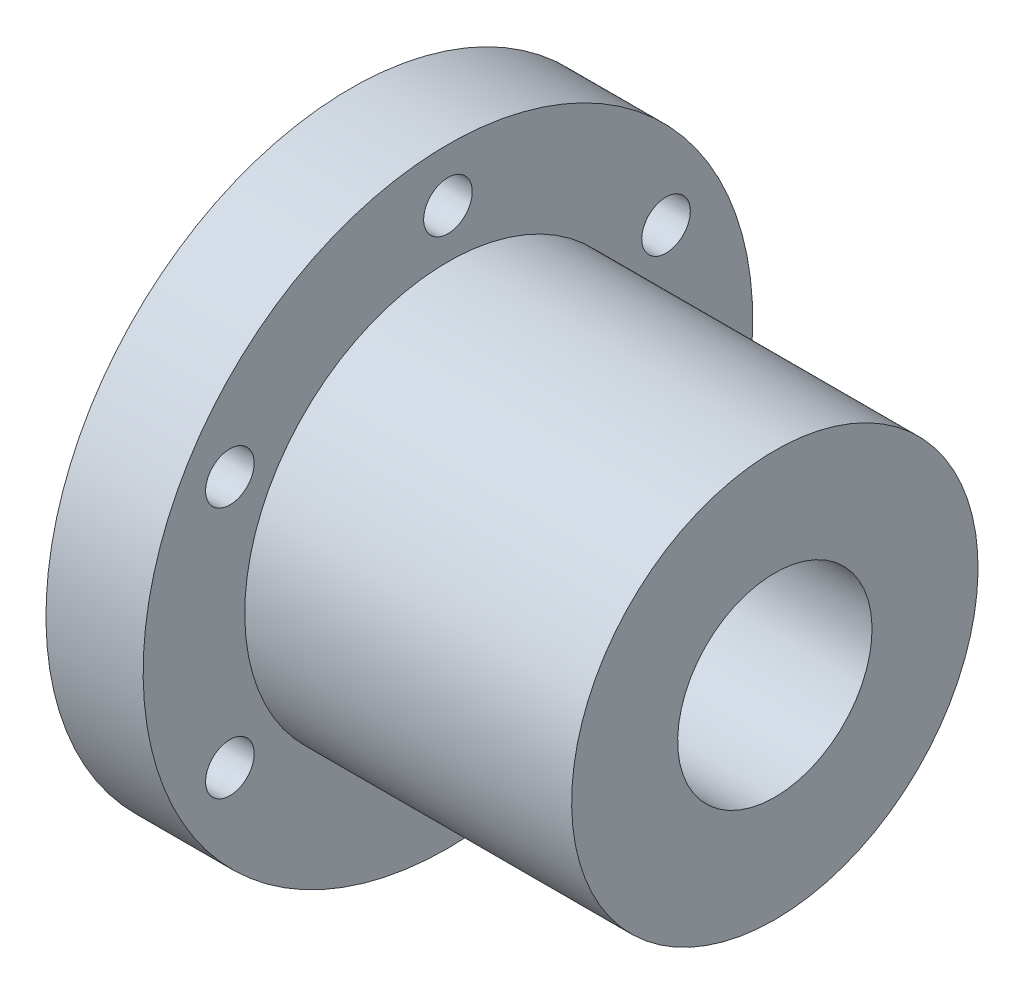
ISO-10303-21;
HEADER;
FILE_DESCRIPTION(('STEP AP214'),'2;1');
FILE_NAME('part.step','',(''),(''),'','','');
FILE_SCHEMA(('AUTOMOTIVE_DESIGN { 1 0 10303 214 1 1 1 1 }'));
ENDSEC;
DATA;
#1=APPLICATION_CONTEXT('core data for automotive mechanical design processes');
#2=APPLICATION_PROTOCOL_DEFINITION('international standard','automotive_design',2000,#1);
#3=PRODUCT_CONTEXT('',#1,'mechanical');
#4=PRODUCT('Part','Part','',(#3));
#5=PRODUCT_RELATED_PRODUCT_CATEGORY('part','',(#4));
#6=PRODUCT_DEFINITION_FORMATION('','',#4);
#7=PRODUCT_DEFINITION_CONTEXT('part definition',#1,'design');
#8=PRODUCT_DEFINITION('design','',#6,#7);
#9=PRODUCT_DEFINITION_SHAPE('','',#8);
#10=(LENGTH_UNIT() NAMED_UNIT(*) SI_UNIT(.MILLI.,.METRE.));
#11=(NAMED_UNIT(*) PLANE_ANGLE_UNIT() SI_UNIT($,.RADIAN.));
#12=(NAMED_UNIT(*) SI_UNIT($,.STERADIAN.) SOLID_ANGLE_UNIT());
#13=UNCERTAINTY_MEASURE_WITH_UNIT(LENGTH_MEASURE(1.E-05),#10,'distance_accuracy_value','');
#14=(GEOMETRIC_REPRESENTATION_CONTEXT(3) GLOBAL_UNCERTAINTY_ASSIGNED_CONTEXT((#13)) GLOBAL_UNIT_ASSIGNED_CONTEXT((#10,
#11,#12)) REPRESENTATION_CONTEXT('',''));
#15=CARTESIAN_POINT('',(0.,0.,0.));
#16=DIRECTION('',(0.,0.,1.));
#17=DIRECTION('',(1.,0.,0.));
#18=AXIS2_PLACEMENT_3D('',#15,#16,#17);
#19=CARTESIAN_POINT('',(24.001,-14.2499999999999,24.6817240078565));
#20=DIRECTION('',(-1.,0.,0.));
#21=DIRECTION('',(0.,-1.,0.));
#22=AXIS2_PLACEMENT_3D('',#19,#20,#21);
#23=CYLINDRICAL_SURFACE('',#22,2.75);
#24=CARTESIAN_POINT('',(-13.,-14.2499999999999,24.6817240078565));
#25=DIRECTION('',(-1.,0.,0.));
#26=DIRECTION('',(0.,-1.,0.));
#27=AXIS2_PLACEMENT_3D('',#24,#25,#26);
#28=CIRCLE('',#27,2.75);
#29=CARTESIAN_POINT('',(-13.,-16.9999999999999,24.6817240078565));
#30=VERTEX_POINT('',#29);
#31=EDGE_CURVE('E80',#30,#30,#28,.F.);
#32=ORIENTED_EDGE('',*,*,#31,.T.);
#33=EDGE_LOOP('',(#32));
#34=FACE_BOUND('',#33,.T.);
#35=CARTESIAN_POINT('',(-18.5,-14.2499999999999,24.6817240078565));
#36=DIRECTION('',(-1.,0.,0.));
#37=DIRECTION('',(0.,-1.,0.));
#38=AXIS2_PLACEMENT_3D('',#35,#36,#37);
#39=CIRCLE('',#38,2.75);
#40=CARTESIAN_POINT('',(-18.5,-16.9999999999999,24.6817240078565));
#41=VERTEX_POINT('',#40);
#42=EDGE_CURVE('E35',#41,#41,#39,.F.);
#43=ORIENTED_EDGE('',*,*,#42,.F.);
#44=EDGE_LOOP('',(#43));
#45=FACE_BOUND('',#44,.T.);
#46=ADVANCED_FACE('F31',(#34,#45),#23,.F.);
#47=CARTESIAN_POINT('',(24.001,14.2500000000001,24.6817240078564));
#48=DIRECTION('',(-1.,0.,0.));
#49=DIRECTION('',(0.,-1.,0.));
#50=AXIS2_PLACEMENT_3D('',#47,#48,#49);
#51=CYLINDRICAL_SURFACE('',#50,2.75);
#52=CARTESIAN_POINT('',(-13.,14.2500000000001,24.6817240078564));
#53=DIRECTION('',(-1.,0.,0.));
#54=DIRECTION('',(0.,-1.,0.));
#55=AXIS2_PLACEMENT_3D('',#52,#53,#54);
#56=CIRCLE('',#55,2.75);
#57=CARTESIAN_POINT('',(-13.,11.5000000000001,24.6817240078564));
#58=VERTEX_POINT('',#57);
#59=EDGE_CURVE('E84',#58,#58,#56,.F.);
#60=ORIENTED_EDGE('',*,*,#59,.T.);
#61=EDGE_LOOP('',(#60));
#62=FACE_BOUND('',#61,.T.);
#63=CARTESIAN_POINT('',(-18.5,14.2500000000001,24.6817240078564));
#64=DIRECTION('',(-1.,0.,0.));
#65=DIRECTION('',(0.,-1.,0.));
#66=AXIS2_PLACEMENT_3D('',#63,#64,#65);
#67=CIRCLE('',#66,2.75);
#68=CARTESIAN_POINT('',(-18.5,11.5000000000001,24.6817240078564));
#69=VERTEX_POINT('',#68);
#70=EDGE_CURVE('E62',#69,#69,#67,.F.);
#71=ORIENTED_EDGE('',*,*,#70,.F.);
#72=EDGE_LOOP('',(#71));
#73=FACE_BOUND('',#72,.T.);
#74=ADVANCED_FACE('F138',(#62,#73),#51,.F.);
#75=CARTESIAN_POINT('',(24.001,28.5,0.));
#76=DIRECTION('',(-1.,0.,0.));
#77=DIRECTION('',(0.,-1.,0.));
#78=AXIS2_PLACEMENT_3D('',#75,#76,#77);
#79=CYLINDRICAL_SURFACE('',#78,2.75);
#80=CARTESIAN_POINT('',(-13.,28.5,0.));
#81=DIRECTION('',(-1.,0.,0.));
#82=DIRECTION('',(0.,-1.,0.));
#83=AXIS2_PLACEMENT_3D('',#80,#81,#82);
#84=CIRCLE('',#83,2.75);
#85=CARTESIAN_POINT('',(-13.,25.75,0.));
#86=VERTEX_POINT('',#85);
#87=EDGE_CURVE('E76',#86,#86,#84,.F.);
#88=CARTESIAN_POINT('',(-18.5,28.5,0.));
#89=DIRECTION('',(-1.,0.,0.));
#90=DIRECTION('',(0.,-1.,0.));
#91=AXIS2_PLACEMENT_3D('',#88,#89,#90);
#92=CIRCLE('',#91,2.75);
#93=CARTESIAN_POINT('',(-18.5,25.75,0.));
#94=VERTEX_POINT('',#93);
#95=EDGE_CURVE('E60',#94,#94,#92,.F.);
#96=CARTESIAN_POINT('',(-13.,25.75,0.));
#97=CARTESIAN_POINT('',(-13.0572916666667,25.75,0.));
#98=CARTESIAN_POINT('',(-13.1145833333333,25.75,0.));
#99=CARTESIAN_POINT('',(-13.2291666666667,25.75,0.));
#100=CARTESIAN_POINT('',(-13.2864583333333,25.75,0.));
#101=CARTESIAN_POINT('',(-13.4010416666667,25.75,0.));
#102=CARTESIAN_POINT('',(-13.4583333333333,25.75,0.));
#103=CARTESIAN_POINT('',(-13.5729166666667,25.75,0.));
#104=CARTESIAN_POINT('',(-13.6302083333333,25.75,0.));
#105=CARTESIAN_POINT('',(-13.7447916666667,25.75,0.));
#106=CARTESIAN_POINT('',(-13.8020833333333,25.75,0.));
#107=CARTESIAN_POINT('',(-13.9166666666667,25.75,0.));
#108=CARTESIAN_POINT('',(-13.9739583333333,25.75,0.));
#109=CARTESIAN_POINT('',(-14.0885416666667,25.75,0.));
#110=CARTESIAN_POINT('',(-14.1458333333333,25.75,0.));
#111=CARTESIAN_POINT('',(-14.2604166666667,25.75,0.));
#112=CARTESIAN_POINT('',(-14.3177083333333,25.75,0.));
#113=CARTESIAN_POINT('',(-14.4322916666667,25.75,0.));
#114=CARTESIAN_POINT('',(-14.4895833333333,25.75,0.));
#115=CARTESIAN_POINT('',(-14.6041666666667,25.75,0.));
#116=CARTESIAN_POINT('',(-14.6614583333333,25.75,0.));
#117=CARTESIAN_POINT('',(-14.7760416666667,25.75,0.));
#118=CARTESIAN_POINT('',(-14.8333333333333,25.75,0.));
#119=CARTESIAN_POINT('',(-14.9479166666667,25.75,0.));
#120=CARTESIAN_POINT('',(-15.0052083333333,25.75,0.));
#121=CARTESIAN_POINT('',(-15.1197916666667,25.75,0.));
#122=CARTESIAN_POINT('',(-15.1770833333333,25.75,0.));
#123=CARTESIAN_POINT('',(-15.2916666666667,25.75,0.));
#124=CARTESIAN_POINT('',(-15.3489583333333,25.75,0.));
#125=CARTESIAN_POINT('',(-15.4635416666667,25.75,0.));
#126=CARTESIAN_POINT('',(-15.5208333333333,25.75,0.));
#127=CARTESIAN_POINT('',(-15.6354166666667,25.75,0.));
#128=CARTESIAN_POINT('',(-15.6927083333333,25.75,0.));
#129=CARTESIAN_POINT('',(-15.8072916666667,25.75,0.));
#130=CARTESIAN_POINT('',(-15.8645833333333,25.75,0.));
#131=CARTESIAN_POINT('',(-15.9791666666667,25.75,0.));
#132=CARTESIAN_POINT('',(-16.0364583333333,25.75,0.));
#133=CARTESIAN_POINT('',(-16.1510416666667,25.75,0.));
#134=CARTESIAN_POINT('',(-16.2083333333333,25.75,0.));
#135=CARTESIAN_POINT('',(-16.3229166666667,25.75,0.));
#136=CARTESIAN_POINT('',(-16.3802083333333,25.75,0.));
#137=CARTESIAN_POINT('',(-16.4947916666667,25.75,0.));
#138=CARTESIAN_POINT('',(-16.5520833333333,25.75,0.));
#139=CARTESIAN_POINT('',(-16.6666666666667,25.75,0.));
#140=CARTESIAN_POINT('',(-16.7239583333333,25.75,0.));
#141=CARTESIAN_POINT('',(-16.8385416666667,25.75,0.));
#142=CARTESIAN_POINT('',(-16.8958333333333,25.75,0.));
#143=CARTESIAN_POINT('',(-17.0104166666667,25.75,0.));
#144=CARTESIAN_POINT('',(-17.0677083333333,25.75,0.));
#145=CARTESIAN_POINT('',(-17.1822916666667,25.75,0.));
#146=CARTESIAN_POINT('',(-17.2395833333333,25.75,0.));
#147=CARTESIAN_POINT('',(-17.3541666666667,25.75,0.));
#148=CARTESIAN_POINT('',(-17.4114583333333,25.75,0.));
#149=CARTESIAN_POINT('',(-17.5260416666667,25.75,0.));
#150=CARTESIAN_POINT('',(-17.5833333333333,25.75,0.));
#151=CARTESIAN_POINT('',(-17.6979166666667,25.75,0.));
#152=CARTESIAN_POINT('',(-17.7552083333333,25.75,0.));
#153=CARTESIAN_POINT('',(-17.8697916666667,25.75,0.));
#154=CARTESIAN_POINT('',(-17.9270833333333,25.75,0.));
#155=CARTESIAN_POINT('',(-18.0416666666667,25.75,0.));
#156=CARTESIAN_POINT('',(-18.0989583333333,25.75,0.));
#157=CARTESIAN_POINT('',(-18.2135416666667,25.75,0.));
#158=CARTESIAN_POINT('',(-18.2708333333333,25.75,0.));
#159=CARTESIAN_POINT('',(-18.3854166666667,25.75,0.));
#160=CARTESIAN_POINT('',(-18.4427083333333,25.75,0.));
#161=CARTESIAN_POINT('',(-18.5,25.75,0.));
#162=B_SPLINE_CURVE_WITH_KNOTS('',3,(#96,#97,#98,#99,#100,#101,#102,#103,#104,#105,#106,#107,
#108,#109,#110,#111,#112,#113,#114,#115,#116,#117,#118,#119,#120,#121,#122,#123,#124,#125,#126,
#127,#128,#129,#130,#131,#132,#133,#134,#135,#136,#137,#138,#139,#140,#141,#142,#143,#144,#145,
#146,#147,#148,#149,#150,#151,#152,#153,#154,#155,#156,#157,#158,#159,#160,#161),.UNSPECIFIED.,
.F.,.F.,(4,2,2,2,2,2,2,2,2,2,2,2,2,2,2,2,2,2,2,2,2,2,2,2,2,2,2,2,2,2,2,2,4),(0.,
0.171875000000002,0.343750000000004,0.515624999999999,0.687500000000001,0.859375000000002,
1.03125,1.203125,1.375,1.546875,1.71875,1.890625,2.0625,2.234375,2.40625,2.578125,2.75,2.921875,
3.09375000000001,3.265625,3.4375,3.609375,3.78125,3.953125,4.125,4.29687500000001,
4.46875000000001,4.640625,4.8125,4.98437500000001,5.15625,5.328125,5.50000000000001),.UNSPECIFIED.);
#163=EDGE_CURVE('BSEAM144',#86,#94,#162,.T.);
#164=ORIENTED_EDGE('',*,*,#87,.T.);
#165=ORIENTED_EDGE('',*,*,#95,.F.);
#166=ORIENTED_EDGE('',*,*,#163,.T.);
#167=ORIENTED_EDGE('',*,*,#163,.F.);
#168=EDGE_LOOP('',(#164,#166,#165,#167));
#169=FACE_BOUND('',#168,.T.);
#170=ADVANCED_FACE('F144',(#169),#79,.F.);
#171=CARTESIAN_POINT('',(24.001,14.2499999999998,-24.6817240078566));
#172=DIRECTION('',(-1.,0.,0.));
#173=DIRECTION('',(0.,-1.,0.));
#174=AXIS2_PLACEMENT_3D('',#171,#172,#173);
#175=CYLINDRICAL_SURFACE('',#174,2.75);
#176=CARTESIAN_POINT('',(-13.,14.2499999999998,-24.6817240078566));
#177=DIRECTION('',(-1.,0.,0.));
#178=DIRECTION('',(0.,-1.,0.));
#179=AXIS2_PLACEMENT_3D('',#176,#177,#178);
#180=CIRCLE('',#179,2.75);
#181=CARTESIAN_POINT('',(-13.,11.4999999999998,-24.6817240078566));
#182=VERTEX_POINT('',#181);
#183=EDGE_CURVE('E71',#182,#182,#180,.F.);
#184=ORIENTED_EDGE('',*,*,#183,.T.);
#185=EDGE_LOOP('',(#184));
#186=FACE_BOUND('',#185,.T.);
#187=CARTESIAN_POINT('',(-18.5,14.2499999999998,-24.6817240078566));
#188=DIRECTION('',(-1.,0.,0.));
#189=DIRECTION('',(0.,-1.,0.));
#190=AXIS2_PLACEMENT_3D('',#187,#188,#189);
#191=CIRCLE('',#190,2.75);
#192=CARTESIAN_POINT('',(-18.5,11.4999999999998,-24.6817240078566));
#193=VERTEX_POINT('',#192);
#194=EDGE_CURVE('E56',#193,#193,#191,.F.);
#195=ORIENTED_EDGE('',*,*,#194,.F.);
#196=EDGE_LOOP('',(#195));
#197=FACE_BOUND('',#196,.T.);
#198=ADVANCED_FACE('F241',(#186,#197),#175,.F.);
#199=CARTESIAN_POINT('',(24.001,-14.2500000000003,-24.6817240078563));
#200=DIRECTION('',(-1.,0.,0.));
#201=DIRECTION('',(0.,-1.,0.));
#202=AXIS2_PLACEMENT_3D('',#199,#200,#201);
#203=CYLINDRICAL_SURFACE('',#202,2.75);
#204=CARTESIAN_POINT('',(-13.,-14.2500000000003,-24.6817240078563));
#205=DIRECTION('',(-1.,0.,0.));
#206=DIRECTION('',(0.,-1.,0.));
#207=AXIS2_PLACEMENT_3D('',#204,#205,#206);
#208=CIRCLE('',#207,2.75);
#209=CARTESIAN_POINT('',(-13.,-17.0000000000003,-24.6817240078563));
#210=VERTEX_POINT('',#209);
#211=EDGE_CURVE('E67',#210,#210,#208,.F.);
#212=ORIENTED_EDGE('',*,*,#211,.T.);
#213=EDGE_LOOP('',(#212));
#214=FACE_BOUND('',#213,.T.);
#215=CARTESIAN_POINT('',(-18.5,-14.2500000000003,-24.6817240078563));
#216=DIRECTION('',(-1.,0.,0.));
#217=DIRECTION('',(0.,-1.,0.));
#218=AXIS2_PLACEMENT_3D('',#215,#216,#217);
#219=CIRCLE('',#218,2.75);
#220=CARTESIAN_POINT('',(-18.5,-17.0000000000003,-24.6817240078563));
#221=VERTEX_POINT('',#220);
#222=EDGE_CURVE('E53',#221,#221,#219,.F.);
#223=ORIENTED_EDGE('',*,*,#222,.F.);
#224=EDGE_LOOP('',(#223));
#225=FACE_BOUND('',#224,.T.);
#226=ADVANCED_FACE('F132',(#214,#225),#203,.F.);
#227=CARTESIAN_POINT('',(24.001,-28.5,0.));
#228=DIRECTION('',(-1.,0.,0.));
#229=DIRECTION('',(0.,-1.,0.));
#230=AXIS2_PLACEMENT_3D('',#227,#228,#229);
#231=CYLINDRICAL_SURFACE('',#230,2.75);
#232=CARTESIAN_POINT('',(-13.,-28.5,0.));
#233=DIRECTION('',(-1.,0.,0.));
#234=DIRECTION('',(0.,-1.,0.));
#235=AXIS2_PLACEMENT_3D('',#232,#233,#234);
#236=CIRCLE('',#235,2.75);
#237=CARTESIAN_POINT('',(-13.,-31.25,0.));
#238=VERTEX_POINT('',#237);
#239=EDGE_CURVE('E51',#238,#238,#236,.F.);
#240=CARTESIAN_POINT('',(-18.5,-28.5,0.));
#241=DIRECTION('',(-1.,0.,0.));
#242=DIRECTION('',(0.,-1.,0.));
#243=AXIS2_PLACEMENT_3D('',#240,#241,#242);
#244=CIRCLE('',#243,2.75);
#245=CARTESIAN_POINT('',(-18.5,-31.25,0.));
#246=VERTEX_POINT('',#245);
#247=EDGE_CURVE('E48',#246,#246,#244,.F.);
#248=CARTESIAN_POINT('',(-13.,-31.25,0.));
#249=CARTESIAN_POINT('',(-13.0572916666667,-31.25,0.));
#250=CARTESIAN_POINT('',(-13.1145833333333,-31.25,0.));
#251=CARTESIAN_POINT('',(-13.2291666666667,-31.25,0.));
#252=CARTESIAN_POINT('',(-13.2864583333333,-31.25,0.));
#253=CARTESIAN_POINT('',(-13.4010416666667,-31.25,0.));
#254=CARTESIAN_POINT('',(-13.4583333333333,-31.25,0.));
#255=CARTESIAN_POINT('',(-13.5729166666667,-31.25,0.));
#256=CARTESIAN_POINT('',(-13.6302083333333,-31.25,0.));
#257=CARTESIAN_POINT('',(-13.7447916666667,-31.25,0.));
#258=CARTESIAN_POINT('',(-13.8020833333333,-31.25,0.));
#259=CARTESIAN_POINT('',(-13.9166666666667,-31.25,0.));
#260=CARTESIAN_POINT('',(-13.9739583333333,-31.25,0.));
#261=CARTESIAN_POINT('',(-14.0885416666667,-31.25,0.));
#262=CARTESIAN_POINT('',(-14.1458333333333,-31.25,0.));
#263=CARTESIAN_POINT('',(-14.2604166666667,-31.25,0.));
#264=CARTESIAN_POINT('',(-14.3177083333333,-31.25,0.));
#265=CARTESIAN_POINT('',(-14.4322916666667,-31.25,0.));
#266=CARTESIAN_POINT('',(-14.4895833333333,-31.25,0.));
#267=CARTESIAN_POINT('',(-14.6041666666667,-31.25,0.));
#268=CARTESIAN_POINT('',(-14.6614583333333,-31.25,0.));
#269=CARTESIAN_POINT('',(-14.7760416666667,-31.25,0.));
#270=CARTESIAN_POINT('',(-14.8333333333333,-31.25,0.));
#271=CARTESIAN_POINT('',(-14.9479166666667,-31.25,0.));
#272=CARTESIAN_POINT('',(-15.0052083333333,-31.25,0.));
#273=CARTESIAN_POINT('',(-15.1197916666667,-31.25,0.));
#274=CARTESIAN_POINT('',(-15.1770833333333,-31.25,0.));
#275=CARTESIAN_POINT('',(-15.2916666666667,-31.25,0.));
#276=CARTESIAN_POINT('',(-15.3489583333333,-31.25,0.));
#277=CARTESIAN_POINT('',(-15.4635416666667,-31.25,0.));
#278=CARTESIAN_POINT('',(-15.5208333333333,-31.25,0.));
#279=CARTESIAN_POINT('',(-15.6354166666666,-31.25,0.));
#280=CARTESIAN_POINT('',(-15.6927083333333,-31.25,0.));
#281=CARTESIAN_POINT('',(-15.8072916666667,-31.25,0.));
#282=CARTESIAN_POINT('',(-15.8645833333333,-31.25,0.));
#283=CARTESIAN_POINT('',(-15.9791666666666,-31.25,0.));
#284=CARTESIAN_POINT('',(-16.0364583333333,-31.25,0.));
#285=CARTESIAN_POINT('',(-16.1510416666666,-31.25,0.));
#286=CARTESIAN_POINT('',(-16.2083333333333,-31.25,0.));
#287=CARTESIAN_POINT('',(-16.3229166666667,-31.25,0.));
#288=CARTESIAN_POINT('',(-16.3802083333333,-31.25,0.));
#289=CARTESIAN_POINT('',(-16.4947916666666,-31.25,0.));
#290=CARTESIAN_POINT('',(-16.5520833333333,-31.25,0.));
#291=CARTESIAN_POINT('',(-16.6666666666666,-31.25,0.));
#292=CARTESIAN_POINT('',(-16.7239583333333,-31.25,0.));
#293=CARTESIAN_POINT('',(-16.8385416666666,-31.25,0.));
#294=CARTESIAN_POINT('',(-16.8958333333333,-31.25,0.));
#295=CARTESIAN_POINT('',(-17.0104166666666,-31.25,0.));
#296=CARTESIAN_POINT('',(-17.0677083333333,-31.25,0.));
#297=CARTESIAN_POINT('',(-17.1822916666666,-31.25,0.));
#298=CARTESIAN_POINT('',(-17.2395833333333,-31.25,0.));
#299=CARTESIAN_POINT('',(-17.3541666666666,-31.25,0.));
#300=CARTESIAN_POINT('',(-17.4114583333333,-31.25,0.));
#301=CARTESIAN_POINT('',(-17.5260416666666,-31.25,0.));
#302=CARTESIAN_POINT('',(-17.5833333333333,-31.25,0.));
#303=CARTESIAN_POINT('',(-17.6979166666666,-31.25,0.));
#304=CARTESIAN_POINT('',(-17.7552083333333,-31.25,0.));
#305=CARTESIAN_POINT('',(-17.8697916666666,-31.25,0.));
#306=CARTESIAN_POINT('',(-17.9270833333333,-31.25,0.));
#307=CARTESIAN_POINT('',(-18.0416666666666,-31.25,0.));
#308=CARTESIAN_POINT('',(-18.0989583333333,-31.25,0.));
#309=CARTESIAN_POINT('',(-18.2135416666666,-31.25,0.));
#310=CARTESIAN_POINT('',(-18.2708333333333,-31.25,0.));
#311=CARTESIAN_POINT('',(-18.3854166666666,-31.25,0.));
#312=CARTESIAN_POINT('',(-18.4427083333333,-31.25,0.));
#313=CARTESIAN_POINT('',(-18.5,-31.25,0.));
#314=B_SPLINE_CURVE_WITH_KNOTS('',3,(#248,#249,#250,#251,#252,#253,#254,#255,#256,#257,#258,
#259,#260,#261,#262,#263,#264,#265,#266,#267,#268,#269,#270,#271,#272,#273,#274,#275,#276,#277,
#278,#279,#280,#281,#282,#283,#284,#285,#286,#287,#288,#289,#290,#291,#292,#293,#294,#295,#296,
#297,#298,#299,#300,#301,#302,#303,#304,#305,#306,#307,#308,#309,#310,#311,#312,#313),
.UNSPECIFIED.,.F.,.F.,(4,2,2,2,2,2,2,2,2,2,2,2,2,2,2,2,2,2,2,2,2,2,2,2,2,2,2,2,2,2,2,2,4),(0.,
0.171875000000002,0.343749999999997,0.515624999999999,0.687500000000001,0.859374999999996,
1.03125,1.203125,1.375,1.546875,1.71875,1.890625,2.06249999999999,2.234375,2.40625,
2.57812499999999,2.75,2.921875,3.09374999999999,3.26562499999999,3.4375,3.60937499999999,
3.78124999999999,3.95312499999999,4.12499999999999,4.29687499999999,4.46874999999999,4.640625,
4.81249999999999,4.98437499999999,5.15624999999999,5.32812499999999,5.49999999999999),.UNSPECIFIED.);
#315=EDGE_CURVE('BSEAM125',#238,#246,#314,.T.);
#316=ORIENTED_EDGE('',*,*,#239,.T.);
#317=ORIENTED_EDGE('',*,*,#247,.F.);
#318=ORIENTED_EDGE('',*,*,#315,.T.);
#319=ORIENTED_EDGE('',*,*,#315,.F.);
#320=EDGE_LOOP('',(#316,#318,#317,#319));
#321=FACE_BOUND('',#320,.T.);
#322=ADVANCED_FACE('F125',(#321),#231,.F.);
#323=CARTESIAN_POINT('',(-24.,11.,0.));
#324=DIRECTION('',(1.,0.,0.));
#325=DIRECTION('',(0.,1.,0.));
#326=AXIS2_PLACEMENT_3D('',#323,#324,#325);
#327=PLANE('',#326);
#328=CARTESIAN_POINT('',(-24.,-14.2500000000003,-24.6817240078563));
#329=DIRECTION('',(-1.,0.,0.));
#330=DIRECTION('',(0.,-0.50000000000001,-0.866025403784433));
#331=AXIS2_PLACEMENT_3D('',#328,#329,#330);
#332=CIRCLE('',#331,4.75);
#333=CARTESIAN_POINT('',(-24.,-16.6250000000003,-28.7953446758324));
#334=VERTEX_POINT('',#333);
#335=EDGE_CURVE('E189',#334,#334,#332,.T.);
#336=ORIENTED_EDGE('',*,*,#335,.F.);
#337=EDGE_LOOP('',(#336));
#338=FACE_BOUND('',#337,.T.);
#339=CARTESIAN_POINT('',(-24.,14.2499999999998,-24.6817240078566));
#340=DIRECTION('',(-1.,0.,0.));
#341=DIRECTION('',(0.,0.499999999999992,-0.866025403784443));
#342=AXIS2_PLACEMENT_3D('',#339,#340,#341);
#343=CIRCLE('',#342,4.75);
#344=CARTESIAN_POINT('',(-24.,16.6249999999997,-28.7953446758327));
#345=VERTEX_POINT('',#344);
#346=EDGE_CURVE('E195',#345,#345,#343,.T.);
#347=ORIENTED_EDGE('',*,*,#346,.F.);
#348=EDGE_LOOP('',(#347));
#349=FACE_BOUND('',#348,.T.);
#350=CARTESIAN_POINT('',(-24.,28.5,0.));
#351=DIRECTION('',(-1.,0.,0.));
#352=DIRECTION('',(0.,1.,0.));
#353=AXIS2_PLACEMENT_3D('',#350,#351,#352);
#354=CIRCLE('',#353,4.75);
#355=CARTESIAN_POINT('',(-24.,33.25,0.));
#356=VERTEX_POINT('',#355);
#357=EDGE_CURVE('E201',#356,#356,#354,.T.);
#358=ORIENTED_EDGE('',*,*,#357,.F.);
#359=EDGE_LOOP('',(#358));
#360=FACE_BOUND('',#359,.T.);
#361=CARTESIAN_POINT('',(-24.,14.2500000000001,24.6817240078564));
#362=DIRECTION('',(-1.,0.,0.));
#363=DIRECTION('',(0.,0.500000000000004,0.866025403784436));
#364=AXIS2_PLACEMENT_3D('',#361,#362,#363);
#365=CIRCLE('',#364,4.75);
#366=CARTESIAN_POINT('',(-24.,16.6250000000001,28.7953446758325));
#367=VERTEX_POINT('',#366);
#368=EDGE_CURVE('E207',#367,#367,#365,.T.);
#369=ORIENTED_EDGE('',*,*,#368,.F.);
#370=EDGE_LOOP('',(#369));
#371=FACE_BOUND('',#370,.T.);
#372=CARTESIAN_POINT('',(-24.,-14.2499999999999,24.6817240078565));
#373=DIRECTION('',(-1.,0.,0.));
#374=DIRECTION('',(0.,-0.499999999999998,0.86602540378444));
#375=AXIS2_PLACEMENT_3D('',#372,#373,#374);
#376=CIRCLE('',#375,4.75);
#377=CARTESIAN_POINT('',(-24.,-16.6249999999999,28.7953446758326));
#378=VERTEX_POINT('',#377);
#379=EDGE_CURVE('E183',#378,#378,#376,.T.);
#380=ORIENTED_EDGE('',*,*,#379,.F.);
#381=EDGE_LOOP('',(#380));
#382=FACE_BOUND('',#381,.T.);
#383=CARTESIAN_POINT('',(-24.,-28.5,0.));
#384=DIRECTION('',(-1.,0.,0.));
#385=DIRECTION('',(0.,-1.,0.));
#386=AXIS2_PLACEMENT_3D('',#383,#384,#385);
#387=CIRCLE('',#386,4.75);
#388=CARTESIAN_POINT('',(-24.,-33.25,0.));
#389=VERTEX_POINT('',#388);
#390=EDGE_CURVE('E83',#389,#389,#387,.T.);
#391=ORIENTED_EDGE('',*,*,#390,.F.);
#392=EDGE_LOOP('',(#391));
#393=FACE_BOUND('',#392,.T.);
#394=CARTESIAN_POINT('',(-24.,0.,0.));
#395=DIRECTION('',(-1.,0.,0.));
#396=DIRECTION('',(0.,-1.,0.));
#397=AXIS2_PLACEMENT_3D('',#394,#395,#396);
#398=CIRCLE('',#397,11.);
#399=CARTESIAN_POINT('',(-24.,-11.,0.));
#400=VERTEX_POINT('',#399);
#401=EDGE_CURVE('E91',#400,#400,#398,.T.);
#402=ORIENTED_EDGE('',*,*,#401,.F.);
#403=EDGE_LOOP('',(#402));
#404=FACE_BOUND('',#403,.T.);
#405=CARTESIAN_POINT('',(-24.,0.,0.));
#406=DIRECTION('',(-1.,0.,0.));
#407=DIRECTION('',(0.,-1.,0.));
#408=AXIS2_PLACEMENT_3D('',#405,#406,#407);
#409=CIRCLE('',#408,34.5);
#410=CARTESIAN_POINT('',(-24.,-34.5,0.));
#411=VERTEX_POINT('',#410);
#412=EDGE_CURVE('E10',#411,#411,#409,.T.);
#413=ORIENTED_EDGE('',*,*,#412,.T.);
#414=EDGE_LOOP('',(#413));
#415=FACE_BOUND('',#414,.T.);
#416=ADVANCED_FACE('F33',(#338,#349,#360,#371,#382,#393,#404,#415),#327,.F.);
#417=CARTESIAN_POINT('',(-82.1060159268319,0.,0.));
#418=DIRECTION('',(-1.,0.,0.));
#419=DIRECTION('',(0.,-1.,0.));
#420=AXIS2_PLACEMENT_3D('',#417,#418,#419);
#421=CYLINDRICAL_SURFACE('',#420,34.5);
#422=ORIENTED_EDGE('',*,*,#412,.F.);
#423=EDGE_LOOP('',(#422));
#424=FACE_BOUND('',#423,.T.);
#425=CARTESIAN_POINT('',(-13.,0.,0.));
#426=DIRECTION('',(-1.,0.,0.));
#427=DIRECTION('',(0.,-1.,0.));
#428=AXIS2_PLACEMENT_3D('',#425,#426,#427);
#429=CIRCLE('',#428,34.5);
#430=CARTESIAN_POINT('',(-13.,-34.5,0.));
#431=VERTEX_POINT('',#430);
#432=EDGE_CURVE('E39',#431,#431,#429,.T.);
#433=ORIENTED_EDGE('',*,*,#432,.T.);
#434=EDGE_LOOP('',(#433));
#435=FACE_BOUND('',#434,.T.);
#436=ADVANCED_FACE('F124',(#424,#435),#421,.T.);
#437=CARTESIAN_POINT('',(-13.,34.5,0.));
#438=DIRECTION('',(-1.,0.,0.));
#439=DIRECTION('',(0.,-1.,0.));
#440=AXIS2_PLACEMENT_3D('',#437,#438,#439);
#441=PLANE('',#440);
#442=ORIENTED_EDGE('',*,*,#211,.F.);
#443=EDGE_LOOP('',(#442));
#444=FACE_BOUND('',#443,.T.);
#445=ORIENTED_EDGE('',*,*,#183,.F.);
#446=EDGE_LOOP('',(#445));
#447=FACE_BOUND('',#446,.T.);
#448=ORIENTED_EDGE('',*,*,#87,.F.);
#449=EDGE_LOOP('',(#448));
#450=FACE_BOUND('',#449,.T.);
#451=ORIENTED_EDGE('',*,*,#59,.F.);
#452=EDGE_LOOP('',(#451));
#453=FACE_BOUND('',#452,.T.);
#454=ORIENTED_EDGE('',*,*,#31,.F.);
#455=EDGE_LOOP('',(#454));
#456=FACE_BOUND('',#455,.T.);
#457=ORIENTED_EDGE('',*,*,#239,.F.);
#458=EDGE_LOOP('',(#457));
#459=FACE_BOUND('',#458,.T.);
#460=ORIENTED_EDGE('',*,*,#432,.F.);
#461=EDGE_LOOP('',(#460));
#462=FACE_BOUND('',#461,.T.);
#463=CARTESIAN_POINT('',(-13.,0.,0.));
#464=DIRECTION('',(-1.,0.,0.));
#465=DIRECTION('',(0.,-1.,0.));
#466=AXIS2_PLACEMENT_3D('',#463,#464,#465);
#467=CIRCLE('',#466,23.);
#468=CARTESIAN_POINT('',(-13.,-23.,0.));
#469=VERTEX_POINT('',#468);
#470=EDGE_CURVE('E44',#469,#469,#467,.T.);
#471=ORIENTED_EDGE('',*,*,#470,.T.);
#472=EDGE_LOOP('',(#471));
#473=FACE_BOUND('',#472,.T.);
#474=ADVANCED_FACE('F102',(#444,#447,#450,#453,#456,#459,#462,#473),#441,.F.);
#475=CARTESIAN_POINT('',(-82.1060159268319,0.,0.));
#476=DIRECTION('',(-1.,0.,0.));
#477=DIRECTION('',(0.,-1.,0.));
#478=AXIS2_PLACEMENT_3D('',#475,#476,#477);
#479=CYLINDRICAL_SURFACE('',#478,23.);
#480=ORIENTED_EDGE('',*,*,#470,.F.);
#481=EDGE_LOOP('',(#480));
#482=FACE_BOUND('',#481,.T.);
#483=CARTESIAN_POINT('',(24.,0.,0.));
#484=DIRECTION('',(-1.,0.,0.));
#485=DIRECTION('',(0.,-1.,0.));
#486=AXIS2_PLACEMENT_3D('',#483,#484,#485);
#487=CIRCLE('',#486,23.);
#488=CARTESIAN_POINT('',(24.,-23.,0.));
#489=VERTEX_POINT('',#488);
#490=EDGE_CURVE('E97',#489,#489,#487,.T.);
#491=ORIENTED_EDGE('',*,*,#490,.T.);
#492=EDGE_LOOP('',(#491));
#493=FACE_BOUND('',#492,.T.);
#494=ADVANCED_FACE('F104',(#482,#493),#479,.T.);
#495=CARTESIAN_POINT('',(24.,23.,0.));
#496=DIRECTION('',(-1.,0.,0.));
#497=DIRECTION('',(0.,-1.,0.));
#498=AXIS2_PLACEMENT_3D('',#495,#496,#497);
#499=PLANE('',#498);
#500=ORIENTED_EDGE('',*,*,#490,.F.);
#501=EDGE_LOOP('',(#500));
#502=FACE_BOUND('',#501,.T.);
#503=CARTESIAN_POINT('',(24.,0.,0.));
#504=DIRECTION('',(-1.,0.,0.));
#505=DIRECTION('',(0.,-1.,0.));
#506=AXIS2_PLACEMENT_3D('',#503,#504,#505);
#507=CIRCLE('',#506,11.);
#508=CARTESIAN_POINT('',(24.,-11.,0.));
#509=VERTEX_POINT('',#508);
#510=EDGE_CURVE('E94',#509,#509,#507,.T.);
#511=ORIENTED_EDGE('',*,*,#510,.T.);
#512=EDGE_LOOP('',(#511));
#513=FACE_BOUND('',#512,.T.);
#514=ADVANCED_FACE('F107',(#502,#513),#499,.F.);
#515=CARTESIAN_POINT('',(-82.1060159268319,0.,0.));
#516=DIRECTION('',(-1.,0.,0.));
#517=DIRECTION('',(0.,-1.,0.));
#518=AXIS2_PLACEMENT_3D('',#515,#516,#517);
#519=CYLINDRICAL_SURFACE('',#518,11.);
#520=ORIENTED_EDGE('',*,*,#510,.F.);
#521=EDGE_LOOP('',(#520));
#522=FACE_BOUND('',#521,.T.);
#523=ORIENTED_EDGE('',*,*,#401,.T.);
#524=EDGE_LOOP('',(#523));
#525=FACE_BOUND('',#524,.T.);
#526=ADVANCED_FACE('F113',(#522,#525),#519,.F.);
#527=CARTESIAN_POINT('',(-18.5,-28.5,0.));
#528=DIRECTION('',(-1.,0.,0.));
#529=DIRECTION('',(0.,-1.,0.));
#530=AXIS2_PLACEMENT_3D('',#527,#528,#529);
#531=PLANE('',#530);
#532=CARTESIAN_POINT('',(-18.5,-28.5,0.));
#533=DIRECTION('',(-1.,0.,0.));
#534=DIRECTION('',(0.,-1.,0.));
#535=AXIS2_PLACEMENT_3D('',#532,#533,#534);
#536=CIRCLE('',#535,4.75);
#537=CARTESIAN_POINT('',(-18.5,-33.25,0.));
#538=VERTEX_POINT('',#537);
#539=EDGE_CURVE('E52',#538,#538,#536,.T.);
#540=ORIENTED_EDGE('',*,*,#539,.T.);
#541=EDGE_LOOP('',(#540));
#542=FACE_BOUND('',#541,.T.);
#543=ORIENTED_EDGE('',*,*,#247,.T.);
#544=EDGE_LOOP('',(#543));
#545=FACE_BOUND('',#544,.T.);
#546=ADVANCED_FACE('F119',(#542,#545),#531,.T.);
#547=CARTESIAN_POINT('',(-18.5,-28.5,0.));
#548=DIRECTION('',(-1.,0.,0.));
#549=DIRECTION('',(0.,-1.,0.));
#550=AXIS2_PLACEMENT_3D('',#547,#548,#549);
#551=CYLINDRICAL_SURFACE('',#550,4.75);
#552=ORIENTED_EDGE('',*,*,#539,.F.);
#553=EDGE_LOOP('',(#552));
#554=FACE_BOUND('',#553,.T.);
#555=ORIENTED_EDGE('',*,*,#390,.T.);
#556=EDGE_LOOP('',(#555));
#557=FACE_BOUND('',#556,.T.);
#558=ADVANCED_FACE('F153',(#554,#557),#551,.F.);
#559=CARTESIAN_POINT('',(-18.5,-14.2500000000003,-24.6817240078563));
#560=DIRECTION('',(-1.,0.,0.));
#561=DIRECTION('',(0.,-0.50000000000001,-0.866025403784433));
#562=AXIS2_PLACEMENT_3D('',#559,#560,#561);
#563=PLANE('',#562);
#564=CARTESIAN_POINT('',(-18.5,-14.2500000000003,-24.6817240078563));
#565=DIRECTION('',(-1.,0.,0.));
#566=DIRECTION('',(0.,-0.50000000000001,-0.866025403784433));
#567=AXIS2_PLACEMENT_3D('',#564,#565,#566);
#568=CIRCLE('',#567,4.75);
#569=CARTESIAN_POINT('',(-18.5,-16.6250000000003,-28.7953446758324));
#570=VERTEX_POINT('',#569);
#571=EDGE_CURVE('E192',#570,#570,#568,.T.);
#572=ORIENTED_EDGE('',*,*,#571,.T.);
#573=EDGE_LOOP('',(#572));
#574=FACE_BOUND('',#573,.T.);
#575=ORIENTED_EDGE('',*,*,#222,.T.);
#576=EDGE_LOOP('',(#575));
#577=FACE_BOUND('',#576,.T.);
#578=ADVANCED_FACE('F156',(#574,#577),#563,.T.);
#579=CARTESIAN_POINT('',(-18.5,-14.2500000000003,-24.6817240078563));
#580=DIRECTION('',(-1.,0.,0.));
#581=DIRECTION('',(0.,-1.,0.));
#582=AXIS2_PLACEMENT_3D('',#579,#580,#581);
#583=CYLINDRICAL_SURFACE('',#582,4.75);
#584=ORIENTED_EDGE('',*,*,#571,.F.);
#585=EDGE_LOOP('',(#584));
#586=FACE_BOUND('',#585,.T.);
#587=ORIENTED_EDGE('',*,*,#335,.T.);
#588=EDGE_LOOP('',(#587));
#589=FACE_BOUND('',#588,.T.);
#590=ADVANCED_FACE('F254',(#586,#589),#583,.F.);
#591=CARTESIAN_POINT('',(-18.5,14.2499999999998,-24.6817240078566));
#592=DIRECTION('',(-1.,0.,0.));
#593=DIRECTION('',(0.,0.499999999999992,-0.866025403784443));
#594=AXIS2_PLACEMENT_3D('',#591,#592,#593);
#595=PLANE('',#594);
#596=CARTESIAN_POINT('',(-18.5,14.2499999999998,-24.6817240078566));
#597=DIRECTION('',(-1.,0.,0.));
#598=DIRECTION('',(0.,0.499999999999992,-0.866025403784443));
#599=AXIS2_PLACEMENT_3D('',#596,#597,#598);
#600=CIRCLE('',#599,4.75);
#601=CARTESIAN_POINT('',(-18.5,16.6249999999997,-28.7953446758327));
#602=VERTEX_POINT('',#601);
#603=EDGE_CURVE('E198',#602,#602,#600,.T.);
#604=ORIENTED_EDGE('',*,*,#603,.T.);
#605=EDGE_LOOP('',(#604));
#606=FACE_BOUND('',#605,.T.);
#607=ORIENTED_EDGE('',*,*,#194,.T.);
#608=EDGE_LOOP('',(#607));
#609=FACE_BOUND('',#608,.T.);
#610=ADVANCED_FACE('F251',(#606,#609),#595,.T.);
#611=CARTESIAN_POINT('',(-18.5,14.2499999999998,-24.6817240078566));
#612=DIRECTION('',(-1.,0.,0.));
#613=DIRECTION('',(0.,-1.,0.));
#614=AXIS2_PLACEMENT_3D('',#611,#612,#613);
#615=CYLINDRICAL_SURFACE('',#614,4.75);
#616=ORIENTED_EDGE('',*,*,#603,.F.);
#617=EDGE_LOOP('',(#616));
#618=FACE_BOUND('',#617,.T.);
#619=ORIENTED_EDGE('',*,*,#346,.T.);
#620=EDGE_LOOP('',(#619));
#621=FACE_BOUND('',#620,.T.);
#622=ADVANCED_FACE('F253',(#618,#621),#615,.F.);
#623=CARTESIAN_POINT('',(-18.5,28.5,0.));
#624=DIRECTION('',(-1.,0.,0.));
#625=DIRECTION('',(0.,1.,0.));
#626=AXIS2_PLACEMENT_3D('',#623,#624,#625);
#627=PLANE('',#626);
#628=CARTESIAN_POINT('',(-18.5,28.5,0.));
#629=DIRECTION('',(-1.,0.,0.));
#630=DIRECTION('',(0.,1.,0.));
#631=AXIS2_PLACEMENT_3D('',#628,#629,#630);
#632=CIRCLE('',#631,4.75);
#633=CARTESIAN_POINT('',(-18.5,33.25,0.));
#634=VERTEX_POINT('',#633);
#635=EDGE_CURVE('E204',#634,#634,#632,.T.);
#636=ORIENTED_EDGE('',*,*,#635,.T.);
#637=EDGE_LOOP('',(#636));
#638=FACE_BOUND('',#637,.T.);
#639=ORIENTED_EDGE('',*,*,#95,.T.);
#640=EDGE_LOOP('',(#639));
#641=FACE_BOUND('',#640,.T.);
#642=ADVANCED_FACE('F261',(#638,#641),#627,.T.);
#643=CARTESIAN_POINT('',(-18.5,28.5,0.));
#644=DIRECTION('',(-1.,0.,0.));
#645=DIRECTION('',(0.,-1.,0.));
#646=AXIS2_PLACEMENT_3D('',#643,#644,#645);
#647=CYLINDRICAL_SURFACE('',#646,4.75);
#648=ORIENTED_EDGE('',*,*,#635,.F.);
#649=EDGE_LOOP('',(#648));
#650=FACE_BOUND('',#649,.T.);
#651=ORIENTED_EDGE('',*,*,#357,.T.);
#652=EDGE_LOOP('',(#651));
#653=FACE_BOUND('',#652,.T.);
#654=ADVANCED_FACE('F266',(#650,#653),#647,.F.);
#655=CARTESIAN_POINT('',(-18.5,14.2500000000001,24.6817240078564));
#656=DIRECTION('',(-1.,0.,0.));
#657=DIRECTION('',(0.,0.500000000000004,0.866025403784436));
#658=AXIS2_PLACEMENT_3D('',#655,#656,#657);
#659=PLANE('',#658);
#660=CARTESIAN_POINT('',(-18.5,14.2500000000001,24.6817240078564));
#661=DIRECTION('',(-1.,0.,0.));
#662=DIRECTION('',(0.,0.500000000000004,0.866025403784436));
#663=AXIS2_PLACEMENT_3D('',#660,#661,#662);
#664=CIRCLE('',#663,4.75);
#665=CARTESIAN_POINT('',(-18.5,16.6250000000001,28.7953446758325));
#666=VERTEX_POINT('',#665);
#667=EDGE_CURVE('E186',#666,#666,#664,.T.);
#668=ORIENTED_EDGE('',*,*,#667,.T.);
#669=EDGE_LOOP('',(#668));
#670=FACE_BOUND('',#669,.T.);
#671=ORIENTED_EDGE('',*,*,#70,.T.);
#672=EDGE_LOOP('',(#671));
#673=FACE_BOUND('',#672,.T.);
#674=ADVANCED_FACE('F213',(#670,#673),#659,.T.);
#675=CARTESIAN_POINT('',(-18.5,14.2500000000001,24.6817240078564));
#676=DIRECTION('',(-1.,0.,0.));
#677=DIRECTION('',(0.,-1.,0.));
#678=AXIS2_PLACEMENT_3D('',#675,#676,#677);
#679=CYLINDRICAL_SURFACE('',#678,4.75);
#680=ORIENTED_EDGE('',*,*,#667,.F.);
#681=EDGE_LOOP('',(#680));
#682=FACE_BOUND('',#681,.T.);
#683=ORIENTED_EDGE('',*,*,#368,.T.);
#684=EDGE_LOOP('',(#683));
#685=FACE_BOUND('',#684,.T.);
#686=ADVANCED_FACE('F215',(#682,#685),#679,.F.);
#687=CARTESIAN_POINT('',(-18.5,-14.2499999999999,24.6817240078565));
#688=DIRECTION('',(-1.,0.,0.));
#689=DIRECTION('',(0.,-0.499999999999998,0.86602540378444));
#690=AXIS2_PLACEMENT_3D('',#687,#688,#689);
#691=PLANE('',#690);
#692=CARTESIAN_POINT('',(-18.5,-14.2499999999999,24.6817240078565));
#693=DIRECTION('',(-1.,0.,0.));
#694=DIRECTION('',(0.,-0.499999999999998,0.86602540378444));
#695=AXIS2_PLACEMENT_3D('',#692,#693,#694);
#696=CIRCLE('',#695,4.75);
#697=CARTESIAN_POINT('',(-18.5,-16.6249999999999,28.7953446758326));
#698=VERTEX_POINT('',#697);
#699=EDGE_CURVE('E57',#698,#698,#696,.T.);
#700=ORIENTED_EDGE('',*,*,#699,.T.);
#701=EDGE_LOOP('',(#700));
#702=FACE_BOUND('',#701,.T.);
#703=ORIENTED_EDGE('',*,*,#42,.T.);
#704=EDGE_LOOP('',(#703));
#705=FACE_BOUND('',#704,.T.);
#706=ADVANCED_FACE('F218',(#702,#705),#691,.T.);
#707=CARTESIAN_POINT('',(-18.5,-14.2499999999999,24.6817240078565));
#708=DIRECTION('',(-1.,0.,0.));
#709=DIRECTION('',(0.,-1.,0.));
#710=AXIS2_PLACEMENT_3D('',#707,#708,#709);
#711=CYLINDRICAL_SURFACE('',#710,4.75);
#712=ORIENTED_EDGE('',*,*,#699,.F.);
#713=EDGE_LOOP('',(#712));
#714=FACE_BOUND('',#713,.T.);
#715=ORIENTED_EDGE('',*,*,#379,.T.);
#716=EDGE_LOOP('',(#715));
#717=FACE_BOUND('',#716,.T.);
#718=ADVANCED_FACE('F228',(#714,#717),#711,.F.);
#719=CLOSED_SHELL('',(#46,#74,#170,#198,#226,#322,#416,#436,#474,#494,#514,#526,#546,#558,#578,
#590,#610,#622,#642,#654,#674,#686,#706,#718));
#720=MANIFOLD_SOLID_BREP('B2',#719);
#721=ADVANCED_BREP_SHAPE_REPRESENTATION('',(#18,#720),#14);
#722=SHAPE_DEFINITION_REPRESENTATION(#9,#721);
ENDSEC;
END-ISO-10303-21;
